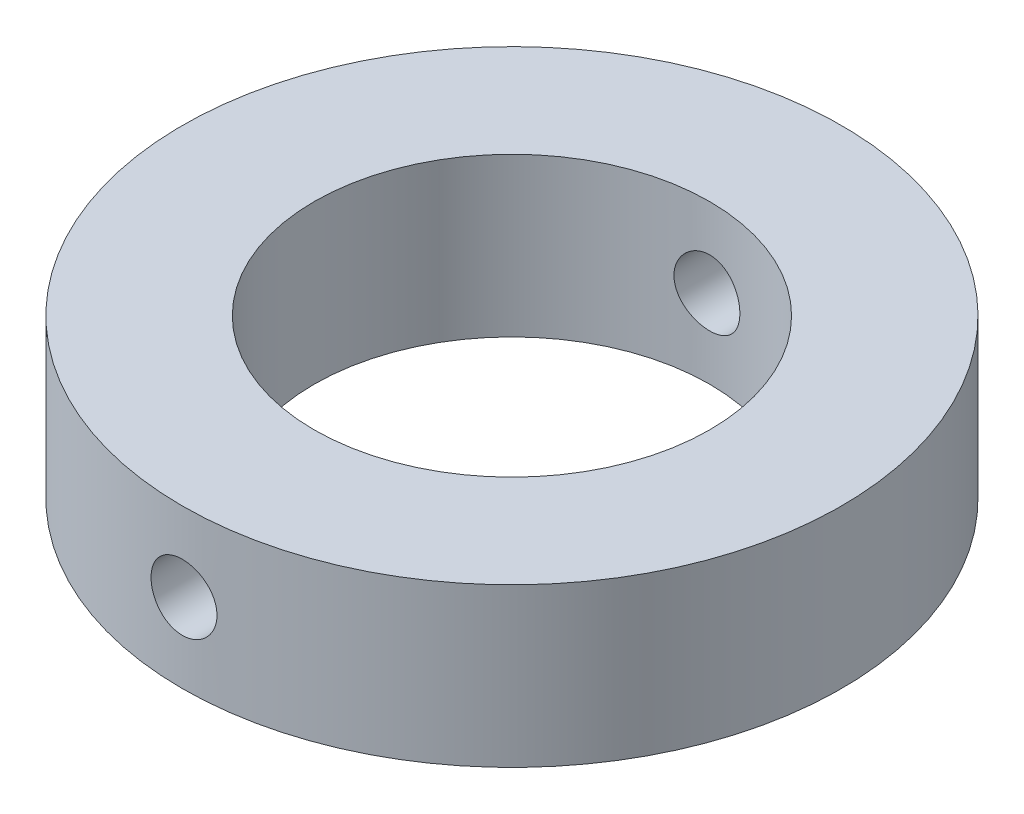
ISO-10303-21;
HEADER;
FILE_DESCRIPTION(('STEP AP214'),'2;1');
FILE_NAME('part.step','',(''),(''),'','','');
FILE_SCHEMA(('AUTOMOTIVE_DESIGN { 1 0 10303 214 1 1 1 1 }'));
ENDSEC;
DATA;
#1=APPLICATION_CONTEXT('core data for automotive mechanical design processes');
#2=APPLICATION_PROTOCOL_DEFINITION('international standard','automotive_design',2000,#1);
#3=PRODUCT_CONTEXT('',#1,'mechanical');
#4=PRODUCT('Part','Part','',(#3));
#5=PRODUCT_RELATED_PRODUCT_CATEGORY('part','',(#4));
#6=PRODUCT_DEFINITION_FORMATION('','',#4);
#7=PRODUCT_DEFINITION_CONTEXT('part definition',#1,'design');
#8=PRODUCT_DEFINITION('design','',#6,#7);
#9=PRODUCT_DEFINITION_SHAPE('','',#8);
#10=(LENGTH_UNIT() NAMED_UNIT(*) SI_UNIT(.MILLI.,.METRE.));
#11=(NAMED_UNIT(*) PLANE_ANGLE_UNIT() SI_UNIT($,.RADIAN.));
#12=(NAMED_UNIT(*) SI_UNIT($,.STERADIAN.) SOLID_ANGLE_UNIT());
#13=UNCERTAINTY_MEASURE_WITH_UNIT(LENGTH_MEASURE(1.E-05),#10,'distance_accuracy_value','');
#14=(GEOMETRIC_REPRESENTATION_CONTEXT(3) GLOBAL_UNCERTAINTY_ASSIGNED_CONTEXT((#13)) GLOBAL_UNIT_ASSIGNED_CONTEXT((#10,
#11,#12)) REPRESENTATION_CONTEXT('',''));
#15=CARTESIAN_POINT('',(0.,0.,0.));
#16=DIRECTION('',(0.,0.,1.));
#17=DIRECTION('',(1.,0.,0.));
#18=AXIS2_PLACEMENT_3D('',#15,#16,#17);
#19=CARTESIAN_POINT('',(0.,12.,0.));
#20=DIRECTION('',(0.,1.,0.));
#21=DIRECTION('',(0.,0.,1.));
#22=AXIS2_PLACEMENT_3D('',#19,#20,#21);
#23=PLANE('',#22);
#24=CARTESIAN_POINT('',(0.,12.,0.));
#25=DIRECTION('',(0.,1.,0.));
#26=DIRECTION('',(0.,0.,1.));
#27=AXIS2_PLACEMENT_3D('',#24,#25,#26);
#28=CIRCLE('',#27,25.);
#29=CARTESIAN_POINT('',(0.,12.,25.));
#30=VERTEX_POINT('',#29);
#31=EDGE_CURVE('E10',#30,#30,#28,.T.);
#32=ORIENTED_EDGE('',*,*,#31,.T.);
#33=EDGE_LOOP('',(#32));
#34=FACE_BOUND('',#33,.T.);
#35=CARTESIAN_POINT('',(0.,12.,0.));
#36=DIRECTION('',(0.,1.,0.));
#37=DIRECTION('',(0.,0.,1.));
#38=AXIS2_PLACEMENT_3D('',#35,#36,#37);
#39=CIRCLE('',#38,15.);
#40=CARTESIAN_POINT('',(0.,12.,15.));
#41=VERTEX_POINT('',#40);
#42=EDGE_CURVE('E56',#41,#41,#39,.T.);
#43=ORIENTED_EDGE('',*,*,#42,.F.);
#44=EDGE_LOOP('',(#43));
#45=FACE_BOUND('',#44,.T.);
#46=ADVANCED_FACE('F37',(#34,#45),#23,.T.);
#47=CARTESIAN_POINT('',(0.,0.,0.));
#48=DIRECTION('',(0.,1.,0.));
#49=DIRECTION('',(0.,0.,1.));
#50=AXIS2_PLACEMENT_3D('',#47,#48,#49);
#51=PLANE('',#50);
#52=CARTESIAN_POINT('',(0.,0.,0.));
#53=DIRECTION('',(0.,1.,0.));
#54=DIRECTION('',(0.,0.,1.));
#55=AXIS2_PLACEMENT_3D('',#52,#53,#54);
#56=CIRCLE('',#55,25.);
#57=CARTESIAN_POINT('',(0.,0.,25.));
#58=VERTEX_POINT('',#57);
#59=EDGE_CURVE('E51',#58,#58,#56,.T.);
#60=ORIENTED_EDGE('',*,*,#59,.F.);
#61=EDGE_LOOP('',(#60));
#62=FACE_BOUND('',#61,.T.);
#63=CARTESIAN_POINT('',(0.,0.,0.));
#64=DIRECTION('',(0.,1.,0.));
#65=DIRECTION('',(0.,0.,1.));
#66=AXIS2_PLACEMENT_3D('',#63,#64,#65);
#67=CIRCLE('',#66,15.);
#68=CARTESIAN_POINT('',(0.,0.,15.));
#69=VERTEX_POINT('',#68);
#70=EDGE_CURVE('E59',#69,#69,#67,.T.);
#71=ORIENTED_EDGE('',*,*,#70,.T.);
#72=EDGE_LOOP('',(#71));
#73=FACE_BOUND('',#72,.T.);
#74=ADVANCED_FACE('F95',(#62,#73),#51,.F.);
#75=CARTESIAN_POINT('',(0.,12.,0.));
#76=DIRECTION('',(0.,-1.,0.));
#77=DIRECTION('',(0.,0.,-1.));
#78=AXIS2_PLACEMENT_3D('',#75,#76,#77);
#79=CYLINDRICAL_SURFACE('',#78,25.);
#80=CARTESIAN_POINT('',(0.,8.5,-25.));
#81=CARTESIAN_POINT('',(-0.140050884478893,8.49999393524905,-24.9999983880192));
#82=CARTESIAN_POINT('',(-0.280194362919433,8.48819182775889,-24.9988106399051));
#83=CARTESIAN_POINT('',(-0.556595996242093,8.44128907427393,-24.9941866898684));
#84=CARTESIAN_POINT('',(-0.69284969792207,8.40616275993853,-24.9907480108506));
#85=CARTESIAN_POINT('',(-0.957429188633536,8.31364439850542,-24.9820103640768));
#86=CARTESIAN_POINT('',(-1.08575971153727,8.25626579870382,-24.9767125200177));
#87=CARTESIAN_POINT('',(-1.33094040240102,8.12089773017089,-24.9648489348577));
#88=CARTESIAN_POINT('',(-1.44779284694769,8.04291235999965,-24.9582834459533));
#89=CARTESIAN_POINT('',(-1.66714887668521,7.86824325584432,-24.9445936085331));
#90=CARTESIAN_POINT('',(-1.76960536208723,7.77150050149492,-24.9374675393466));
#91=CARTESIAN_POINT('',(-1.95685630357746,7.56218866434243,-24.9234739226566));
#92=CARTESIAN_POINT('',(-2.04164994270663,7.44961884989403,-24.9166063871229));
#93=CARTESIAN_POINT('',(-2.19133492610904,7.21155367079095,-24.9038897888196));
#94=CARTESIAN_POINT('',(-2.2561836636372,7.08603138976285,-24.8980429177726));
#95=CARTESIAN_POINT('',(-2.3638659618569,6.82581103523755,-24.8880509386631));
#96=CARTESIAN_POINT('',(-2.40670006647823,6.69111318854013,-24.8839057885556));
#97=CARTESIAN_POINT('',(-2.46899760400473,6.41684549783498,-24.8778021018244));
#98=CARTESIAN_POINT('',(-2.48853913250949,6.27729355786948,-24.8758362599524));
#99=CARTESIAN_POINT('',(-2.5039382128384,5.99687784151055,-24.8742910765131));
#100=CARTESIAN_POINT('',(-2.499796387177,5.85601409969485,-24.8747116722186));
#101=CARTESIAN_POINT('',(-2.4680107006317,5.5775117257667,-24.8778851724734));
#102=CARTESIAN_POINT('',(-2.44045211031138,5.43986325167826,-24.8806296147663));
#103=CARTESIAN_POINT('',(-2.36274786037647,5.17115509199726,-24.8881283571855));
#104=CARTESIAN_POINT('',(-2.31260189563937,5.04009549543742,-24.8928826844623));
#105=CARTESIAN_POINT('',(-2.19105223470377,4.78801603175278,-24.9038752363018));
#106=CARTESIAN_POINT('',(-2.11961070679995,4.66701452627671,-24.9101160977039));
#107=CARTESIAN_POINT('',(-1.95752506838307,4.43868696272029,-24.923376293322));
#108=CARTESIAN_POINT('',(-1.86688039584126,4.33136130504559,-24.9303956503196));
#109=CARTESIAN_POINT('',(-1.66848528103017,4.13293651502743,-24.9444596328247));
#110=CARTESIAN_POINT('',(-1.56066119712841,4.04191099529799,-24.9515042333249));
#111=CARTESIAN_POINT('',(-1.33122370434278,3.87924091772403,-24.964795726963));
#112=CARTESIAN_POINT('',(-1.209610279999,3.80759638160881,-24.9710426192064));
#113=CARTESIAN_POINT('',(-0.955995264230913,3.68572494922437,-24.9820368916774));
#114=CARTESIAN_POINT('',(-0.823991865974759,3.63550178795485,-24.9867840103692));
#115=CARTESIAN_POINT('',(-0.553368043324831,3.55795270822062,-24.9942411860352));
#116=CARTESIAN_POINT('',(-0.414747816941502,3.53062610502344,-24.9969513039266));
#117=CARTESIAN_POINT('',(-0.13546274772976,3.49973923066309,-25.0000212917078));
#118=CARTESIAN_POINT('',(0.005190755263729,3.49607737936875,-25.0003912066934));
#119=CARTESIAN_POINT('',(0.285109483289249,3.51235715762191,-24.9987660439199));
#120=CARTESIAN_POINT('',(0.424374727051174,3.5322984682882,-24.9967709981117));
#121=CARTESIAN_POINT('',(0.697270517086686,3.59513423855394,-24.9906465384799));
#122=CARTESIAN_POINT('',(0.830912122430048,3.63798113619503,-24.986521547951));
#123=CARTESIAN_POINT('',(1.08911080345945,3.74536293509318,-24.9765999715152));
#124=CARTESIAN_POINT('',(1.21366767539279,3.80989832259849,-24.9708033481313));
#125=CARTESIAN_POINT('',(1.45062045043036,3.95907709665978,-24.9581618832606));
#126=CARTESIAN_POINT('',(1.56297414937229,4.04378722231454,-24.951313590086));
#127=CARTESIAN_POINT('',(1.77190405827969,4.23081516935232,-24.937348321738));
#128=CARTESIAN_POINT('',(1.86847987212294,4.33313343267579,-24.9302313398243));
#129=CARTESIAN_POINT('',(2.04346527471786,4.5529164366475,-24.9165006035189));
#130=CARTESIAN_POINT('',(2.12180819669886,4.67043439135655,-24.9098887534744));
#131=CARTESIAN_POINT('',(2.25764564685957,4.91701840036671,-24.8979458115222));
#132=CARTESIAN_POINT('',(2.31514046013471,5.04608429672099,-24.8926147021009));
#133=CARTESIAN_POINT('',(2.40753802171119,5.31187184866449,-24.8838486908512));
#134=CARTESIAN_POINT('',(2.44248043702965,5.4485796002278,-24.8804104612447));
#135=CARTESIAN_POINT('',(2.48891001782366,5.72595799490193,-24.8758091320719));
#136=CARTESIAN_POINT('',(2.50039785599879,5.86662852423918,-24.8746459672547));
#137=CARTESIAN_POINT('',(2.49958284617814,6.14727672089176,-24.8747278276891));
#138=CARTESIAN_POINT('',(2.48738472398278,6.28725470720704,-24.8759622521752));
#139=CARTESIAN_POINT('',(2.43976363240913,6.56316229292072,-24.8806775972386));
#140=CARTESIAN_POINT('',(2.4043406369054,6.69909188776495,-24.884158520343));
#141=CARTESIAN_POINT('',(2.31130421574376,6.96304337261964,-24.8929717065797));
#142=CARTESIAN_POINT('',(2.25369386085229,7.09106635407431,-24.898303713509));
#143=CARTESIAN_POINT('',(2.11792888727761,7.33564222917759,-24.910218795984));
#144=CARTESIAN_POINT('',(2.03977438363854,7.45219518705157,-24.9168018645238));
#145=CARTESIAN_POINT('',(1.86474639071333,7.67105918617984,-24.9305121802424));
#146=CARTESIAN_POINT('',(1.76779487222567,7.77330769091772,-24.9376416181688));
#147=CARTESIAN_POINT('',(1.55807924806277,7.96013058174914,-24.9516213682196));
#148=CARTESIAN_POINT('',(1.44531136027064,8.04470072839292,-24.9584716130744));
#149=CARTESIAN_POINT('',(1.20685358540322,8.19393363463655,-24.971139051729));
#150=CARTESIAN_POINT('',(1.08113187336691,8.25854572736296,-24.9769536006703));
#151=CARTESIAN_POINT('',(0.820645697751378,8.36565605705967,-24.9868657312474));
#152=CARTESIAN_POINT('',(0.685891624564024,8.40817922738387,-24.9909652477413));
#153=CARTESIAN_POINT('',(0.458645653514261,8.45930154271201,-24.9959553443433));
#154=CARTESIAN_POINT('',(0.367606382111272,8.47454261074839,-24.9974650172958));
#155=CARTESIAN_POINT('',(0.184391452043282,8.49489381515441,-24.9994878737697));
#156=CARTESIAN_POINT('',(0.0922157980663946,8.50000399330465,-25.0000010614006));
#157=CARTESIAN_POINT('',(0.,8.5,-25.));
#158=B_SPLINE_CURVE_WITH_KNOTS('',3,(#80,#81,#82,#83,#84,#85,#86,#87,#88,#89,#90,#91,#92,#93,
#94,#95,#96,#97,#98,#99,#100,#101,#102,#103,#104,#105,#106,#107,#108,#109,#110,#111,#112,#113,
#114,#115,#116,#117,#118,#119,#120,#121,#122,#123,#124,#125,#126,#127,#128,#129,#130,#131,#132,
#133,#134,#135,#136,#137,#138,#139,#140,#141,#142,#143,#144,#145,#146,#147,#148,#149,#150,#151,
#152,#153,#154,#155,#156,#157),.UNSPECIFIED.,.T.,.F.,(4,2,2,2,2,2,2,2,2,2,2,2,2,2,2,2,2,2,2,2,2,
2,2,2,2,2,2,2,2,2,2,2,2,2,2,2,2,2,4),(0.,0.419815915671184,0.840094607088716,1.26011971433051,
1.68006134395696,2.10134642155736,2.52265098051765,2.94484938680555,3.3670373610626,
3.78780580112992,4.20856318139441,4.62779493602777,5.04703235404084,5.46701903432237,
5.88701800827813,6.30886835490517,6.73071917449429,7.15264351733954,7.57455524188599,
7.99465471519394,8.41474851297859,8.83397338235762,9.25320765123667,9.67384851871746,
10.0944999452558,10.516666090215,10.9388264618844,11.3602422648251,11.7816459809896,
12.2011907323489,12.620735955651,13.04022313407,13.459707963474,13.8809729356913,
14.302338815924,14.7247657756561,15.1467148698824,15.4231416808087,15.6995673517257),.UNSPECIFIED.);
#159=CARTESIAN_POINT('',(0.,8.5,-25.));
#160=VERTEX_POINT('',#159);
#161=EDGE_CURVE('E84',#160,#160,#158,.T.);
#162=ORIENTED_EDGE('',*,*,#161,.T.);
#163=EDGE_LOOP('',(#162));
#164=FACE_BOUND('',#163,.T.);
#165=CARTESIAN_POINT('',(2.5,6.,24.8746859276655));
#166=CARTESIAN_POINT('',(2.49999393348378,5.85995108956599,24.8746875699226));
#167=CARTESIAN_POINT('',(2.48819214745619,5.7198095789704,24.8758814248555));
#168=CARTESIAN_POINT('',(2.44129078690891,5.44341203426616,24.880527188953));
#169=CARTESIAN_POINT('',(2.40616553721609,5.30716045490627,24.8839815865305));
#170=CARTESIAN_POINT('',(2.31365029017232,5.04258545195524,24.8927533261847));
#171=CARTESIAN_POINT('',(2.25627379073475,4.9142572765214,24.8980695386697));
#172=CARTESIAN_POINT('',(2.12091066847775,4.66908051927063,24.9099645142955));
#173=CARTESIAN_POINT('',(2.04292813906481,4.5522296637907,24.9165430266082));
#174=CARTESIAN_POINT('',(1.86826190499676,4.33287184085625,24.9302481677475));
#175=CARTESIAN_POINT('',(1.77151854527065,4.23041247624054,24.9373765001317));
#176=CARTESIAN_POINT('',(1.56220428829891,4.04315597749108,24.951362630893));
#177=CARTESIAN_POINT('',(1.44963266726642,3.95835965148422,24.9582204168803));
#178=CARTESIAN_POINT('',(1.21156590412747,3.80867185748212,24.9709095788901));
#179=CARTESIAN_POINT('',(1.08604415632392,3.74382250301584,24.9767387723662));
#180=CARTESIAN_POINT('',(0.825824960718775,3.63613891712829,24.9866954218943));
#181=CARTESIAN_POINT('',(0.691127736670546,3.59330414907633,24.9908229194266));
#182=CARTESIAN_POINT('',(0.416861956857373,3.53100522661688,24.9968991642756));
#183=CARTESIAN_POINT('',(0.277311317578953,3.51146291812514,24.9988551960704));
#184=CARTESIAN_POINT('',(-0.00310185172235842,3.49606182716571,25.0003928899673));
#185=CARTESIAN_POINT('',(-0.143964347636154,3.50020243063432,24.9999746136318));
#186=CARTESIAN_POINT('',(-0.422472110161401,3.53198618162539,24.9968167827796));
#187=CARTESIAN_POINT('',(-0.560127074837448,3.55954528890973,24.9940855287928));
#188=CARTESIAN_POINT('',(-0.828847948761333,3.63725282236655,24.9866182316233));
#189=CARTESIAN_POINT('',(-0.959913772394322,3.68740154196893,24.9818821623988));
#190=CARTESIAN_POINT('',(-1.21200078669897,3.8089569081361,24.9709234370979));
#191=CARTESIAN_POINT('',(-1.33300392745413,3.88040074382539,24.9646981841439));
#192=CARTESIAN_POINT('',(-1.56133378293549,4.04249130834092,24.9514596129852));
#193=CARTESIAN_POINT('',(-1.66866009640207,4.13313860036296,24.9444462716703));
#194=CARTESIAN_POINT('',(-1.86708192955672,4.33153557378412,24.9303823366963));
#195=CARTESIAN_POINT('',(-1.95810436547586,4.43935836185394,24.9233317143257));
#196=CARTESIAN_POINT('',(-2.12076883839479,4.66879216302694,24.9100184982056));
#197=CARTESIAN_POINT('',(-2.19241084728222,4.79040319613036,24.9037559055991));
#198=CARTESIAN_POINT('',(-2.31428046143308,5.04401756299948,24.8927272378537));
#199=CARTESIAN_POINT('',(-2.3645035514324,5.17602308105722,24.8879614783139));
#200=CARTESIAN_POINT('',(-2.44205183909397,5.44665151153672,24.8804725467734));
#201=CARTESIAN_POINT('',(-2.46937773435758,5.58527422221861,24.8777493125442));
#202=CARTESIAN_POINT('',(-2.5002619384799,5.86456044882377,24.8746645131854));
#203=CARTESIAN_POINT('',(-2.50392249161803,6.00521255066208,24.8742927886901));
#204=CARTESIAN_POINT('',(-2.48764061717841,6.28512816455716,24.8759262838693));
#205=CARTESIAN_POINT('',(-2.46769850852439,6.42439169535092,24.8779314714265));
#206=CARTESIAN_POINT('',(-2.4048629362688,6.69727895569585,24.88408361056));
#207=CARTESIAN_POINT('',(-2.36201781797227,6.83091392773665,24.8882260500336));
#208=CARTESIAN_POINT('',(-2.25464179918985,7.08910012932576,24.8981822759699));
#209=CARTESIAN_POINT('',(-2.19011040195897,7.21365115071796,24.9039961007167));
#210=CARTESIAN_POINT('',(-2.04093750355804,7.45059993507194,24.9166646088928));
#211=CARTESIAN_POINT('',(-1.95622824960173,7.56295485491564,24.9235227703668));
#212=CARTESIAN_POINT('',(-1.76920133362793,7.77188763318517,24.9374958156297));
#213=CARTESIAN_POINT('',(-1.66688323562034,7.86846510085019,24.9446107057716));
#214=CARTESIAN_POINT('',(-1.44709951056618,8.04345408349523,24.9583261962325));
#215=CARTESIAN_POINT('',(-1.32958063992363,8.12179889896555,24.9649248513869));
#216=CARTESIAN_POINT('',(-1.08299429354283,8.25763967126603,24.9768360526658));
#217=CARTESIAN_POINT('',(-0.953926976074063,8.31513591376776,24.9821486164123));
#218=CARTESIAN_POINT('',(-0.688140316082037,8.40753441913834,24.9908802603501));
#219=CARTESIAN_POINT('',(-0.551435094124897,8.44247696831303,24.9943027151412));
#220=CARTESIAN_POINT('',(-0.274062034959197,8.48890767394961,24.9988823653412));
#221=CARTESIAN_POINT('',(-0.133394309230544,8.5003964895851,25.0000396244141));
#222=CARTESIAN_POINT('',(0.147255560189367,8.49958433390015,24.9999584578317));
#223=CARTESIAN_POINT('',(0.28723801806132,8.48738690790836,24.9987304594167));
#224=CARTESIAN_POINT('',(0.563154720890908,8.43976563585756,24.9940373394398));
#225=CARTESIAN_POINT('',(0.699088962670915,8.40434177156758,24.9905722161218));
#226=CARTESIAN_POINT('',(0.963049771919359,8.31130185651767,24.981793095349));
#227=CARTESIAN_POINT('',(1.09107741519382,8.25368883266461,24.9764793500812));
#228=CARTESIAN_POINT('',(1.33566150038699,8.11791707770755,24.9645953104074));
#229=CARTESIAN_POINT('',(1.4522180094214,8.0397584668222,24.9580250233539));
#230=CARTESIAN_POINT('',(1.67108181106735,7.86472595244062,24.9443296167264));
#231=CARTESIAN_POINT('',(1.77332731554835,7.767774959388,24.9372022865175));
#232=CARTESIAN_POINT('',(1.96014439848286,7.55806162113638,24.9232147692415));
#233=CARTESIAN_POINT('',(2.04471172961962,7.44529548707731,24.9163546466944));
#234=CARTESIAN_POINT('',(2.19394160106013,7.20683914520022,24.903659585265));
#235=CARTESIAN_POINT('',(2.25855296998709,7.08111679668987,24.8978272981327));
#236=CARTESIAN_POINT('',(2.36566177024692,6.82062927188442,24.8878798690615));
#237=CARTESIAN_POINT('',(2.40818414472465,6.68587449018571,24.883762791334));
#238=CARTESIAN_POINT('',(2.45930422083382,6.45863064775221,24.8787501884536));
#239=CARTESIAN_POINT('',(2.47454428099556,6.36759437173393,24.8772332983924));
#240=CARTESIAN_POINT('',(2.49489414651279,6.18438544239361,24.8752006294416));
#241=CARTESIAN_POINT('',(2.50000399439316,6.09221279384352,24.8746848463496));
#242=CARTESIAN_POINT('',(2.5,6.,24.8746859276655));
#243=B_SPLINE_CURVE_WITH_KNOTS('',3,(#165,#166,#167,#168,#169,#170,#171,#172,#173,#174,#175,
#176,#177,#178,#179,#180,#181,#182,#183,#184,#185,#186,#187,#188,#189,#190,#191,#192,#193,#194,
#195,#196,#197,#198,#199,#200,#201,#202,#203,#204,#205,#206,#207,#208,#209,#210,#211,#212,#213,
#214,#215,#216,#217,#218,#219,#220,#221,#222,#223,#224,#225,#226,#227,#228,#229,#230,#231,#232,
#233,#234,#235,#236,#237,#238,#239,#240,#241,#242),.UNSPECIFIED.,.T.,.F.,(4,2,2,2,2,2,2,2,2,2,2,
2,2,2,2,2,2,2,2,2,2,2,2,2,2,2,2,2,2,2,2,2,2,2,2,2,2,2,4),(0.,0.419809986091155,
0.840082879554424,1.26010122749369,1.68003620105329,2.10132903824813,2.52264114638132,
2.94483674928229,3.36702206019487,3.78778677246124,4.20854057495581,4.62779079546654,
5.04704646202436,5.46703863666034,5.88704313046322,6.30888562712503,6.73072873568907,
7.15266072794834,7.57457986487582,7.99467490769413,8.41476427417176,8.83397036761318,
9.25318606402618,9.67382974529295,10.0944838430801,10.516653420453,10.9388172129501,
11.360224817359,11.7816205778287,12.2011783367121,12.6207364249165,13.0402372998812,
13.45973572027,13.8809928759497,14.3023511258631,14.7247810267619,15.14673287235,
15.4231506901512,15.6995673475954),.UNSPECIFIED.);
#244=CARTESIAN_POINT('',(2.5,6.,24.8746859276655));
#245=VERTEX_POINT('',#244);
#246=EDGE_CURVE('E79',#245,#245,#243,.T.);
#247=ORIENTED_EDGE('',*,*,#246,.T.);
#248=EDGE_LOOP('',(#247));
#249=FACE_BOUND('',#248,.T.);
#250=ORIENTED_EDGE('',*,*,#31,.F.);
#251=EDGE_LOOP('',(#250));
#252=FACE_BOUND('',#251,.T.);
#253=ORIENTED_EDGE('',*,*,#59,.T.);
#254=EDGE_LOOP('',(#253));
#255=FACE_BOUND('',#254,.T.);
#256=ADVANCED_FACE('F39',(#164,#249,#252,#255),#79,.T.);
#257=CARTESIAN_POINT('',(0.,12.,0.));
#258=DIRECTION('',(0.,-1.,0.));
#259=DIRECTION('',(0.,0.,-1.));
#260=AXIS2_PLACEMENT_3D('',#257,#258,#259);
#261=CYLINDRICAL_SURFACE('',#260,15.);
#262=CARTESIAN_POINT('',(0.,8.5,-15.));
#263=CARTESIAN_POINT('',(-0.139390904958215,8.49999441105218,-14.9999976116882));
#264=CARTESIAN_POINT('',(-0.278857881838821,8.48830272503108,-14.9980367791303));
#265=CARTESIAN_POINT('',(-0.553880221673043,8.44186434123468,-14.9904034494139));
#266=CARTESIAN_POINT('',(-0.689431867959247,8.4070964430884,-14.9847275392389));
#267=CARTESIAN_POINT('',(-0.952604747212644,8.31558455140724,-14.9703006823645));
#268=CARTESIAN_POINT('',(-1.0802323684319,8.25885853435943,-14.9615522515919));
#269=CARTESIAN_POINT('',(-1.32414184197795,8.12508770794761,-14.9419422708207));
#270=CARTESIAN_POINT('',(-1.44042498987859,8.048045222517,-14.9310809625443));
#271=CARTESIAN_POINT('',(-1.65947261429168,7.87504491617954,-14.9083331745831));
#272=CARTESIAN_POINT('',(-1.76211290353497,7.77893088536387,-14.8964387181486));
#273=CARTESIAN_POINT('',(-1.94988849865993,7.57085203152719,-14.8730262687673));
#274=CARTESIAN_POINT('',(-2.03502269939097,7.45888620854339,-14.8615082996267));
#275=CARTESIAN_POINT('',(-2.18586712560513,7.22142903380294,-14.8400756575978));
#276=CARTESIAN_POINT('',(-2.251454552861,7.09585866319524,-14.8301712909164));
#277=CARTESIAN_POINT('',(-2.36055836541122,6.83529043569937,-14.8131978979467));
#278=CARTESIAN_POINT('',(-2.40407624156561,6.70029321632237,-14.8061286801431));
#279=CARTESIAN_POINT('',(-2.46741437778481,6.42601972514346,-14.7957053684276));
#280=CARTESIAN_POINT('',(-2.4874490291354,6.28679426349861,-14.792317684857));
#281=CARTESIAN_POINT('',(-2.50391672528988,6.00691972311653,-14.7895393893665));
#282=CARTESIAN_POINT('',(-2.500351440389,5.8662707458327,-14.7901484945721));
#283=CARTESIAN_POINT('',(-2.46989509839615,5.58907213872455,-14.7952642886356));
#284=CARTESIAN_POINT('',(-2.44324488188977,5.45249519645477,-14.7997307331892));
#285=CARTESIAN_POINT('',(-2.36775314040345,5.18577868217087,-14.8119949521101));
#286=CARTESIAN_POINT('',(-2.31891085431974,5.05563933111145,-14.8197928407327));
#287=CARTESIAN_POINT('',(-2.20017724609391,4.80477117655908,-14.837884793341));
#288=CARTESIAN_POINT('',(-2.13018591387971,4.68409059391877,-14.8481906710733));
#289=CARTESIAN_POINT('',(-1.97121201755743,4.45609559946161,-14.8701291841501));
#290=CARTESIAN_POINT('',(-1.88222792065429,4.34878226754507,-14.8817619265429));
#291=CARTESIAN_POINT('',(-1.68648221215905,4.14917391419265,-14.9052202787979));
#292=CARTESIAN_POINT('',(-1.57951396387313,4.05708148145992,-14.9170464923165));
#293=CARTESIAN_POINT('',(-1.35153524898165,3.89212223733466,-14.9394260139672));
#294=CARTESIAN_POINT('',(-1.23052469190642,3.81925554981677,-14.9499793138975));
#295=CARTESIAN_POINT('',(-0.977705916166711,3.69479777286372,-14.9686389289291));
#296=CARTESIAN_POINT('',(-0.845888725564661,3.64322458066874,-14.9767431840745));
#297=CARTESIAN_POINT('',(-0.575298345602731,3.56300578475402,-14.9895750301266));
#298=CARTESIAN_POINT('',(-0.436525739179468,3.53435826302628,-14.9943029035047));
#299=CARTESIAN_POINT('',(-0.157709901301624,3.50107864153886,-14.9998112984269));
#300=CARTESIAN_POINT('',(-0.0177007371510111,3.49616842819439,-15.0006375301278));
#301=CARTESIAN_POINT('',(0.261139772889888,3.50976134442812,-14.9983747442117));
#302=CARTESIAN_POINT('',(0.399971163892039,3.52826357313374,-14.9952858772412));
#303=CARTESIAN_POINT('',(0.671656175546764,3.58792484933548,-14.985568269382));
#304=CARTESIAN_POINT('',(0.80454086838538,3.62894620839012,-14.9789610480131));
#305=CARTESIAN_POINT('',(1.06154688486044,3.73233451819953,-14.9629446445536));
#306=CARTESIAN_POINT('',(1.18566771590972,3.79470266763527,-14.9535353051202));
#307=CARTESIAN_POINT('',(1.42283068946896,3.93965112469679,-14.9328451630241));
#308=CARTESIAN_POINT('',(1.53576525093715,4.02240515616725,-14.9215485588702));
#309=CARTESIAN_POINT('',(1.74624358550269,4.20553731538506,-14.898384673919));
#310=CARTESIAN_POINT('',(1.84378623969658,4.30591672327667,-14.8865173517155));
#311=CARTESIAN_POINT('',(2.021742779658,4.52269754807142,-14.8634017523585));
#312=CARTESIAN_POINT('',(2.10196876111372,4.63925416551441,-14.8521611613711));
#313=CARTESIAN_POINT('',(2.24170231029499,4.88435296913854,-14.8317152977788));
#314=CARTESIAN_POINT('',(2.30121053476982,5.01289477522749,-14.8225099606602));
#315=CARTESIAN_POINT('',(2.39753833147315,5.27778973281213,-14.807234536977));
#316=CARTESIAN_POINT('',(2.43445143254795,5.41410809503049,-14.8011515431106));
#317=CARTESIAN_POINT('',(2.48483545377828,5.69112012922176,-14.7927771683526));
#318=CARTESIAN_POINT('',(2.49830841194617,5.83181341973205,-14.7904854578272));
#319=CARTESIAN_POINT('',(2.50137286604735,6.11170516596241,-14.7899673308401));
#320=CARTESIAN_POINT('',(2.49126013612519,6.25090037857529,-14.7916905650565));
#321=CARTESIAN_POINT('',(2.44807983895685,6.52557924805077,-14.7988978145373));
#322=CARTESIAN_POINT('',(2.41501234611248,6.66106291694187,-14.8043818176121));
#323=CARTESIAN_POINT('',(2.3269744895949,6.92435843729261,-14.8184735628172));
#324=CARTESIAN_POINT('',(2.27202959060044,7.05217901005602,-14.8270776721967));
#325=CARTESIAN_POINT('',(2.14182700391591,7.29683566919485,-14.8464436892221));
#326=CARTESIAN_POINT('',(2.06656830874856,7.41367121037213,-14.857205703884));
#327=CARTESIAN_POINT('',(1.89681888437216,7.63453558310775,-14.8798345404562));
#328=CARTESIAN_POINT('',(1.80211056359365,7.73839601670027,-14.891712955763));
#329=CARTESIAN_POINT('',(1.59660903138023,7.92885160447494,-14.9151437236084));
#330=CARTESIAN_POINT('',(1.48581211291264,8.01544276863817,-14.9266960002655));
#331=CARTESIAN_POINT('',(1.25036916964028,8.16944826819995,-14.9482652964222));
#332=CARTESIAN_POINT('',(1.12563278753282,8.23672603931295,-14.958271162531));
#333=CARTESIAN_POINT('',(0.866513069378981,8.34926948460992,-14.9755116760178));
#334=CARTESIAN_POINT('',(0.73213949483001,8.3945570810797,-14.9827490817748));
#335=CARTESIAN_POINT('',(0.497703310045401,8.45200527412667,-14.9920579083296));
#336=CARTESIAN_POINT('',(0.399058830298448,8.46997446961596,-14.9950202727336));
#337=CARTESIAN_POINT('',(0.200289310319809,8.49397373784475,-14.9989921598612));
#338=CARTESIAN_POINT('',(0.100164295608494,8.50000401613736,-15.0000017162064));
#339=CARTESIAN_POINT('',(0.,8.5,-15.));
#340=B_SPLINE_CURVE_WITH_KNOTS('',3,(#262,#263,#264,#265,#266,#267,#268,#269,#270,#271,#272,
#273,#274,#275,#276,#277,#278,#279,#280,#281,#282,#283,#284,#285,#286,#287,#288,#289,#290,#291,
#292,#293,#294,#295,#296,#297,#298,#299,#300,#301,#302,#303,#304,#305,#306,#307,#308,#309,#310,
#311,#312,#313,#314,#315,#316,#317,#318,#319,#320,#321,#322,#323,#324,#325,#326,#327,#328,#329,
#330,#331,#332,#333,#334,#335,#336,#337,#338,#339),.UNSPECIFIED.,.T.,.F.,(4,2,2,2,2,2,2,2,2,2,2,
2,2,2,2,2,2,2,2,2,2,2,2,2,2,2,2,2,2,2,2,2,2,2,2,2,2,2,4),(0.,0.41780658493851,0.835997545695421,
1.25384686702527,1.67164841267479,2.09302491062332,2.51442800169857,2.9384252082384,
3.36239376876181,3.78246077103424,4.20249804320887,4.61820521760409,5.03392665025381,
5.45164556632558,5.86939820680574,6.29232769911327,6.71525991635848,7.13854688915904,
7.56179844521149,7.98007883491397,8.3983431303586,8.81407807006416,9.22983635826067,
9.64926825627024,10.0687306305428,10.4925382200762,10.9163323737594,11.3383602234177,
11.7603513778662,12.177079095227,12.5938054618813,13.0100481822622,13.4263115502934,
13.8475138419339,14.2688133387897,14.693022316072,15.1168075213007,15.4170424816402,
15.7172722727697),.UNSPECIFIED.);
#341=CARTESIAN_POINT('',(0.,8.5,-15.));
#342=VERTEX_POINT('',#341);
#343=EDGE_CURVE('E42',#342,#342,#340,.T.);
#344=ORIENTED_EDGE('',*,*,#343,.F.);
#345=EDGE_LOOP('',(#344));
#346=FACE_BOUND('',#345,.T.);
#347=CARTESIAN_POINT('',(2.5,6.,14.790199457749));
#348=CARTESIAN_POINT('',(2.49999439841983,5.86062425183819,14.790201973666));
#349=CARTESIAN_POINT('',(2.48830516902828,5.72117239392853,14.7921909238523));
#350=CARTESIAN_POINT('',(2.44187742806638,5.44618145673683,14.7999245720004));
#351=CARTESIAN_POINT('',(2.40711766030861,5.31064610624193,14.8056727334637));
#352=CARTESIAN_POINT('',(2.31562954367049,5.04750771665839,14.8202560936731));
#353=CARTESIAN_POINT('',(2.25891955493199,4.91989815133775,14.8290887118401));
#354=CARTESIAN_POINT('',(2.12518649688947,4.67601904528223,14.8488427210228));
#355=CARTESIAN_POINT('',(2.04816571350133,4.55974823042267,14.8597638769423));
#356=CARTESIAN_POINT('',(1.87518752696654,4.34068715025544,14.8825847115588));
#357=CARTESIAN_POINT('',(1.77906904893234,4.23802486861378,14.8944921732795));
#358=CARTESIAN_POINT('',(1.57097200469527,4.05020669313819,14.9178748066858));
#359=CARTESIAN_POINT('',(1.45899249914997,3.96505183688458,14.9293499527174));
#360=CARTESIAN_POINT('',(1.22152286994836,3.81418543278072,14.9506573698271));
#361=CARTESIAN_POINT('',(1.09595608145671,3.7485929922682,14.9604794243234));
#362=CARTESIAN_POINT('',(0.835395621723867,3.63947892946945,14.9772873695709));
#363=CARTESIAN_POINT('',(0.700402564078187,3.59595587211512,14.9842734447266));
#364=CARTESIAN_POINT('',(0.426143726344241,3.5326074650161,14.994567347244));
#365=CARTESIAN_POINT('',(0.28692888667927,3.51256708399531,14.9979085311091));
#366=CARTESIAN_POINT('',(0.00707528552579587,3.4960842458474,15.0006507934278));
#367=CARTESIAN_POINT('',(-0.1335633785289,3.49964018475277,15.0000521396931));
#368=CARTESIAN_POINT('',(-0.410802185078877,3.53008135152821,14.9950085843139));
#369=CARTESIAN_POINT('',(-0.547428530700142,3.55673516340915,14.990601836924));
#370=CARTESIAN_POINT('',(-0.814241979611793,3.63225107424649,14.9784797877164));
#371=CARTESIAN_POINT('',(-0.944428886651506,3.6811138495895,14.9707643851321));
#372=CARTESIAN_POINT('',(-1.19535614778265,3.79989064031532,14.9528269851196));
#373=CARTESIAN_POINT('',(-1.31605052301905,3.86990001208244,14.9425936732688));
#374=CARTESIAN_POINT('',(-1.54406552984664,4.02891282263505,14.920757380715));
#375=CARTESIAN_POINT('',(-1.65138507791588,4.11791779871082,14.9091542891913));
#376=CARTESIAN_POINT('',(-1.85097127344667,4.31367880661931,14.885702682326));
#377=CARTESIAN_POINT('',(-1.94303950225321,4.42063709490098,14.8738528973104));
#378=CARTESIAN_POINT('',(-2.10795458844807,4.64858709021582,14.8513795978481));
#379=CARTESIAN_POINT('',(-2.18080126853242,4.76957892668282,14.8407560947132));
#380=CARTESIAN_POINT('',(-2.30524443448829,5.02239164187748,14.8219375456182));
#381=CARTESIAN_POINT('',(-2.35681702727924,5.15422449809209,14.813745233026));
#382=CARTESIAN_POINT('',(-2.43702987081562,5.42484907230755,14.8007618868988));
#383=CARTESIAN_POINT('',(-2.46567214076796,5.56364017643243,14.7959705538832));
#384=CARTESIAN_POINT('',(-2.49893188487927,5.84246615616213,14.7903895942212));
#385=CARTESIAN_POINT('',(-2.50383220791244,5.9824663797021,14.7895528575867));
#386=CARTESIAN_POINT('',(-2.49022270268246,6.26128667169082,14.7918503478236));
#387=CARTESIAN_POINT('',(-2.47171377862467,6.40010678551397,14.7949844213185));
#388=CARTESIAN_POINT('',(-2.4120523349281,6.67172775919086,14.8048268745502));
#389=CARTESIAN_POINT('',(-2.37104379064639,6.80456113987801,14.8115125191835));
#390=CARTESIAN_POINT('',(-2.26769819019228,7.06147016627949,14.827685730055));
#391=CARTESIAN_POINT('',(-2.20535985810094,7.1855452875509,14.8371734639058));
#392=CARTESIAN_POINT('',(-2.06045667322923,7.42267459440611,14.8579912839739));
#393=CARTESIAN_POINT('',(-1.97771056415936,7.53561657275606,14.8693375560035));
#394=CARTESIAN_POINT('',(-1.79458946570798,7.74611353269501,14.8925466667987));
#395=CARTESIAN_POINT('',(-1.69421323638404,7.84366743110974,14.9044095418533));
#396=CARTESIAN_POINT('',(-1.47742807032881,8.02165189272871,14.9274642211826));
#397=CARTESIAN_POINT('',(-1.3608632533862,8.10189382628455,14.9386477634467));
#398=CARTESIAN_POINT('',(-1.11574344794932,8.24165532700488,14.9589511243294));
#399=CARTESIAN_POINT('',(-0.987188847470625,8.30117556447385,14.9680710096998));
#400=CARTESIAN_POINT('',(-0.722299051501326,8.39751058395487,14.9831835816958));
#401=CARTESIAN_POINT('',(-0.586000562602609,8.43442407573492,14.9891898456762));
#402=CARTESIAN_POINT('',(-0.309030734874209,8.48481559896383,14.9974558316928));
#403=CARTESIAN_POINT('',(-0.168359756821618,8.49829555873235,14.9997158620019));
#404=CARTESIAN_POINT('',(0.111541275773678,8.5013818823122,15.0002303788781));
#405=CARTESIAN_POINT('',(0.250768160602667,8.49127525394108,14.9985330202419));
#406=CARTESIAN_POINT('',(0.525511974314707,8.44809607773057,14.9914217838733));
#407=CARTESIAN_POINT('',(0.661028923967481,8.41502365849033,14.9860079269518));
#408=CARTESIAN_POINT('',(0.92439644591854,8.32696183445635,14.972069888274));
#409=CARTESIAN_POINT('',(1.05225537215382,8.27199683178995,14.9635491704088));
#410=CARTESIAN_POINT('',(1.29698045298217,8.14174206376942,14.9443275687803));
#411=CARTESIAN_POINT('',(1.41384608611822,8.06645133493755,14.9336265816741));
#412=CARTESIAN_POINT('',(1.6347129455264,7.8966649075395,14.9110762961641));
#413=CARTESIAN_POINT('',(1.73855143060275,7.80195904524874,14.8992152454112));
#414=CARTESIAN_POINT('',(1.92896387595091,7.59647169209619,14.8757630331437));
#415=CARTESIAN_POINT('',(2.0155337867119,7.48568644108747,14.8641719354951));
#416=CARTESIAN_POINT('',(2.16951427091086,7.25025467751038,14.8424834353391));
#417=CARTESIAN_POINT('',(2.2367849890577,7.12551566023451,14.8323971784578));
#418=CARTESIAN_POINT('',(2.34931453640427,6.86639076416185,14.8149921009131));
#419=CARTESIAN_POINT('',(2.39459535522307,6.73201467732263,14.8076705172488));
#420=CARTESIAN_POINT('',(2.45202605312742,6.49759623051261,14.7982474485649));
#421=CARTESIAN_POINT('',(2.46998741767139,6.39897319203739,14.7952462341947));
#422=CARTESIAN_POINT('',(2.49397629518131,6.20024651516306,14.7912213528807));
#423=CARTESIAN_POINT('',(2.50000402479277,6.1001429036758,14.7901976500369));
#424=CARTESIAN_POINT('',(2.5,6.,14.790199457749));
#425=B_SPLINE_CURVE_WITH_KNOTS('',3,(#347,#348,#349,#350,#351,#352,#353,#354,#355,#356,#357,
#358,#359,#360,#361,#362,#363,#364,#365,#366,#367,#368,#369,#370,#371,#372,#373,#374,#375,#376,
#377,#378,#379,#380,#381,#382,#383,#384,#385,#386,#387,#388,#389,#390,#391,#392,#393,#394,#395,
#396,#397,#398,#399,#400,#401,#402,#403,#404,#405,#406,#407,#408,#409,#410,#411,#412,#413,#414,
#415,#416,#417,#418,#419,#420,#421,#422,#423,#424),.UNSPECIFIED.,.T.,.F.,(4,2,2,2,2,2,2,2,2,2,2,
2,2,2,2,2,2,2,2,2,2,2,2,2,2,2,2,2,2,2,2,2,2,2,2,2,2,2,4),(0.,0.417761038927741,0.83590751996297,
1.25370499787519,1.67145547405274,2.09289159155715,2.51435267834447,2.93832980111435,
3.36227935111113,3.78231567472566,4.20232344652692,4.61817121164669,5.03403164249533,
5.45179604139425,5.86959426226765,6.29246123462124,6.71533210746019,7.13867662498604,
7.56198385938078,7.98023542420411,8.39847083413977,8.81406064635492,9.22967532293575,
9.64912342762702,10.0686010443069,10.4924411303538,10.916267504767,11.3382298441765,
11.7601574591235,12.1769777626592,12.5937957321882,13.0101503983246,13.4265248039234,
13.8476699746325,14.2689137888181,14.6931372761832,15.1169356674445,15.4171067054377,
15.7172722940182),.UNSPECIFIED.);
#426=CARTESIAN_POINT('',(2.5,6.,14.790199457749));
#427=VERTEX_POINT('',#426);
#428=EDGE_CURVE('E61',#427,#427,#425,.T.);
#429=ORIENTED_EDGE('',*,*,#428,.F.);
#430=EDGE_LOOP('',(#429));
#431=FACE_BOUND('',#430,.T.);
#432=ORIENTED_EDGE('',*,*,#42,.T.);
#433=EDGE_LOOP('',(#432));
#434=FACE_BOUND('',#433,.T.);
#435=ORIENTED_EDGE('',*,*,#70,.F.);
#436=EDGE_LOOP('',(#435));
#437=FACE_BOUND('',#436,.T.);
#438=ADVANCED_FACE('F66',(#346,#431,#434,#437),#261,.F.);
#439=CARTESIAN_POINT('',(0.,6.,-25.));
#440=DIRECTION('',(0.,0.,1.));
#441=DIRECTION('',(1.,0.,0.));
#442=AXIS2_PLACEMENT_3D('',#439,#440,#441);
#443=CYLINDRICAL_SURFACE('',#442,2.5);
#444=ORIENTED_EDGE('',*,*,#428,.T.);
#445=EDGE_LOOP('',(#444));
#446=FACE_BOUND('',#445,.T.);
#447=ORIENTED_EDGE('',*,*,#246,.F.);
#448=EDGE_LOOP('',(#447));
#449=FACE_BOUND('',#448,.T.);
#450=ADVANCED_FACE('F72',(#446,#449),#443,.F.);
#451=ORIENTED_EDGE('',*,*,#343,.T.);
#452=EDGE_LOOP('',(#451));
#453=FACE_BOUND('',#452,.T.);
#454=ORIENTED_EDGE('',*,*,#161,.F.);
#455=EDGE_LOOP('',(#454));
#456=FACE_BOUND('',#455,.T.);
#457=ADVANCED_FACE('F69',(#453,#456),#443,.F.);
#458=CLOSED_SHELL('',(#46,#74,#256,#438,#450,#457));
#459=MANIFOLD_SOLID_BREP('B2',#458);
#460=ADVANCED_BREP_SHAPE_REPRESENTATION('',(#18,#459),#14);
#461=SHAPE_DEFINITION_REPRESENTATION(#9,#460);
ENDSEC;
END-ISO-10303-21;
